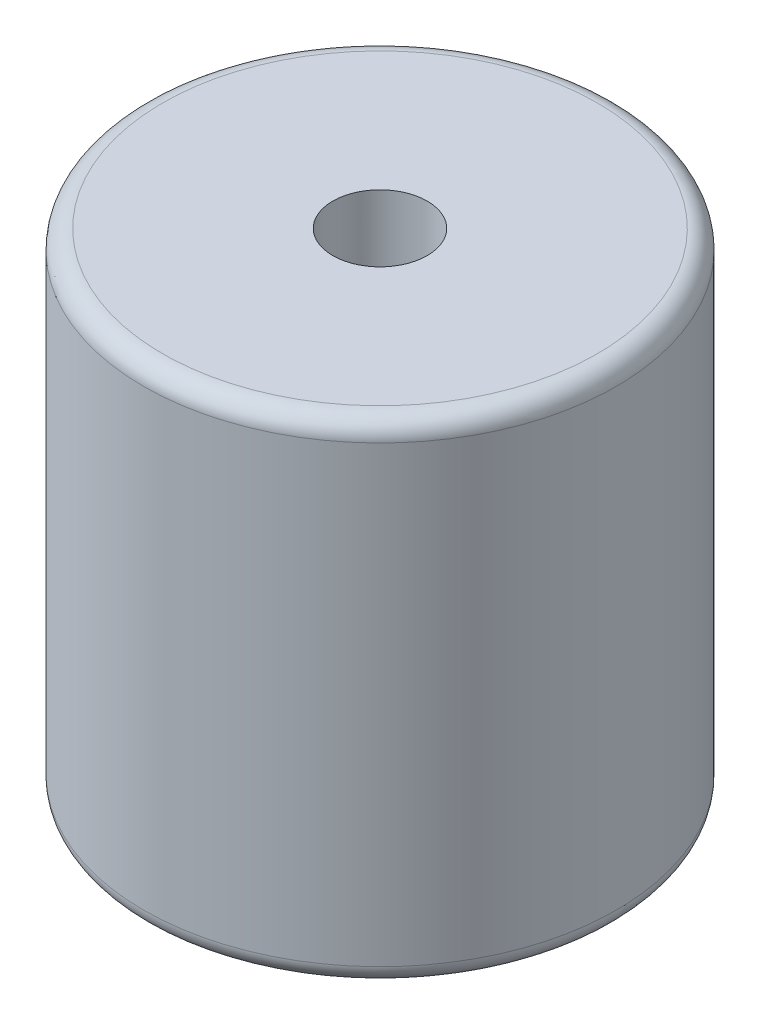
ISO-10303-21;
HEADER;
FILE_DESCRIPTION(('STEP AP214'),'2;1');
FILE_NAME('part.step','',(''),(''),'','','');
FILE_SCHEMA(('AUTOMOTIVE_DESIGN { 1 0 10303 214 1 1 1 1 }'));
ENDSEC;
DATA;
#1=APPLICATION_CONTEXT('core data for automotive mechanical design processes');
#2=APPLICATION_PROTOCOL_DEFINITION('international standard','automotive_design',2000,#1);
#3=PRODUCT_CONTEXT('',#1,'mechanical');
#4=PRODUCT('Part','Part','',(#3));
#5=PRODUCT_RELATED_PRODUCT_CATEGORY('part','',(#4));
#6=PRODUCT_DEFINITION_FORMATION('','',#4);
#7=PRODUCT_DEFINITION_CONTEXT('part definition',#1,'design');
#8=PRODUCT_DEFINITION('design','',#6,#7);
#9=PRODUCT_DEFINITION_SHAPE('','',#8);
#10=(LENGTH_UNIT() NAMED_UNIT(*) SI_UNIT(.MILLI.,.METRE.));
#11=(NAMED_UNIT(*) PLANE_ANGLE_UNIT() SI_UNIT($,.RADIAN.));
#12=(NAMED_UNIT(*) SI_UNIT($,.STERADIAN.) SOLID_ANGLE_UNIT());
#13=UNCERTAINTY_MEASURE_WITH_UNIT(LENGTH_MEASURE(1.E-05),#10,'distance_accuracy_value','');
#14=(GEOMETRIC_REPRESENTATION_CONTEXT(3) GLOBAL_UNCERTAINTY_ASSIGNED_CONTEXT((#13)) GLOBAL_UNIT_ASSIGNED_CONTEXT((#10,
#11,#12)) REPRESENTATION_CONTEXT('',''));
#15=CARTESIAN_POINT('',(0.,0.,0.));
#16=DIRECTION('',(0.,0.,1.));
#17=DIRECTION('',(1.,0.,0.));
#18=AXIS2_PLACEMENT_3D('',#15,#16,#17);
#19=CARTESIAN_POINT('',(0.,-8.,2.5));
#20=DIRECTION('',(0.,-1.,0.));
#21=DIRECTION('',(0.,0.,-1.));
#22=AXIS2_PLACEMENT_3D('',#19,#20,#21);
#23=PLANE('',#22);
#24=CARTESIAN_POINT('',(0.,-8.,0.));
#25=DIRECTION('',(0.,-1.,0.));
#26=DIRECTION('',(0.,0.,-1.));
#27=AXIS2_PLACEMENT_3D('',#24,#25,#26);
#28=CIRCLE('',#27,11.5);
#29=CARTESIAN_POINT('',(0.,-8.,-11.5));
#30=VERTEX_POINT('',#29);
#31=EDGE_CURVE('E21',#30,#30,#28,.F.);
#32=ORIENTED_EDGE('',*,*,#31,.T.);
#33=EDGE_LOOP('',(#32));
#34=FACE_BOUND('',#33,.T.);
#35=CARTESIAN_POINT('',(0.,-8.00000000000001,0.));
#36=DIRECTION('',(0.,-1.,0.));
#37=DIRECTION('',(0.,0.,-1.));
#38=AXIS2_PLACEMENT_3D('',#35,#36,#37);
#39=CIRCLE('',#38,2.5);
#40=CARTESIAN_POINT('',(0.,-8.00000000000001,-2.5));
#41=VERTEX_POINT('',#40);
#42=EDGE_CURVE('E32',#41,#41,#39,.F.);
#43=ORIENTED_EDGE('',*,*,#42,.F.);
#44=EDGE_LOOP('',(#43));
#45=FACE_BOUND('',#44,.T.);
#46=ADVANCED_FACE('F17',(#34,#45),#23,.F.);
#47=CARTESIAN_POINT('',(0.,4.4,0.));
#48=DIRECTION('',(0.,-1.,0.));
#49=DIRECTION('',(0.,0.,-1.));
#50=AXIS2_PLACEMENT_3D('',#47,#48,#49);
#51=CYLINDRICAL_SURFACE('',#50,12.5);
#52=CARTESIAN_POINT('',(0.,-33.,0.));
#53=DIRECTION('',(0.,1.,0.));
#54=DIRECTION('',(0.,0.,1.));
#55=AXIS2_PLACEMENT_3D('',#52,#53,#54);
#56=CIRCLE('',#55,12.5);
#57=CARTESIAN_POINT('',(0.,-33.,12.5));
#58=VERTEX_POINT('',#57);
#59=EDGE_CURVE('E11',#58,#58,#56,.T.);
#60=ORIENTED_EDGE('',*,*,#59,.T.);
#61=EDGE_LOOP('',(#60));
#62=FACE_BOUND('',#61,.T.);
#63=CARTESIAN_POINT('',(0.,-9.,0.));
#64=DIRECTION('',(0.,-1.,0.));
#65=DIRECTION('',(0.,0.,-1.));
#66=AXIS2_PLACEMENT_3D('',#63,#64,#65);
#67=CIRCLE('',#66,12.5);
#68=CARTESIAN_POINT('',(0.,-9.,-12.5));
#69=VERTEX_POINT('',#68);
#70=EDGE_CURVE('E34',#69,#69,#67,.T.);
#71=ORIENTED_EDGE('',*,*,#70,.T.);
#72=EDGE_LOOP('',(#71));
#73=FACE_BOUND('',#72,.T.);
#74=ADVANCED_FACE('F50',(#62,#73),#51,.T.);
#75=CARTESIAN_POINT('',(0.,-34.,14.));
#76=DIRECTION('',(0.,1.,0.));
#77=DIRECTION('',(0.,0.,1.));
#78=AXIS2_PLACEMENT_3D('',#75,#76,#77);
#79=PLANE('',#78);
#80=CARTESIAN_POINT('',(0.,-34.,0.));
#81=DIRECTION('',(0.,1.,0.));
#82=DIRECTION('',(0.,0.,1.));
#83=AXIS2_PLACEMENT_3D('',#80,#81,#82);
#84=CIRCLE('',#83,11.5);
#85=CARTESIAN_POINT('',(0.,-34.,11.5));
#86=VERTEX_POINT('',#85);
#87=EDGE_CURVE('E25',#86,#86,#84,.F.);
#88=ORIENTED_EDGE('',*,*,#87,.T.);
#89=EDGE_LOOP('',(#88));
#90=FACE_BOUND('',#89,.T.);
#91=CARTESIAN_POINT('',(0.,-34.,0.));
#92=DIRECTION('',(0.,1.,0.));
#93=DIRECTION('',(0.,0.,1.));
#94=AXIS2_PLACEMENT_3D('',#91,#92,#93);
#95=CIRCLE('',#94,2.5);
#96=CARTESIAN_POINT('',(0.,-34.,2.5));
#97=VERTEX_POINT('',#96);
#98=EDGE_CURVE('E40',#97,#97,#95,.F.);
#99=ORIENTED_EDGE('',*,*,#98,.F.);
#100=EDGE_LOOP('',(#99));
#101=FACE_BOUND('',#100,.T.);
#102=ADVANCED_FACE('F48',(#90,#101),#79,.F.);
#103=CARTESIAN_POINT('',(0.,-9.,0.));
#104=DIRECTION('',(0.,-1.,0.));
#105=DIRECTION('',(0.,0.,-1.));
#106=AXIS2_PLACEMENT_3D('',#103,#104,#105);
#107=TOROIDAL_SURFACE('',#106,11.5,1.);
#108=ORIENTED_EDGE('',*,*,#31,.F.);
#109=EDGE_LOOP('',(#108));
#110=FACE_BOUND('',#109,.T.);
#111=ORIENTED_EDGE('',*,*,#70,.F.);
#112=EDGE_LOOP('',(#111));
#113=FACE_BOUND('',#112,.T.);
#114=ADVANCED_FACE('F19',(#110,#113),#107,.T.);
#115=CARTESIAN_POINT('',(0.,-33.,0.));
#116=DIRECTION('',(0.,1.,0.));
#117=DIRECTION('',(0.,0.,1.));
#118=AXIS2_PLACEMENT_3D('',#115,#116,#117);
#119=TOROIDAL_SURFACE('',#118,11.5,1.);
#120=ORIENTED_EDGE('',*,*,#59,.F.);
#121=EDGE_LOOP('',(#120));
#122=FACE_BOUND('',#121,.T.);
#123=ORIENTED_EDGE('',*,*,#87,.F.);
#124=EDGE_LOOP('',(#123));
#125=FACE_BOUND('',#124,.T.);
#126=ADVANCED_FACE('F58',(#122,#125),#119,.T.);
#127=CARTESIAN_POINT('',(0.,-79.9282385393826,0.));
#128=DIRECTION('',(0.,1.,0.));
#129=DIRECTION('',(0.,0.,1.));
#130=AXIS2_PLACEMENT_3D('',#127,#128,#129);
#131=CYLINDRICAL_SURFACE('',#130,2.5);
#132=ORIENTED_EDGE('',*,*,#98,.T.);
#133=EDGE_LOOP('',(#132));
#134=FACE_BOUND('',#133,.T.);
#135=ORIENTED_EDGE('',*,*,#42,.T.);
#136=EDGE_LOOP('',(#135));
#137=FACE_BOUND('',#136,.T.);
#138=ADVANCED_FACE('F46',(#134,#137),#131,.F.);
#139=CLOSED_SHELL('',(#46,#74,#102,#114,#126,#138));
#140=MANIFOLD_SOLID_BREP('B1',#139);
#141=ADVANCED_BREP_SHAPE_REPRESENTATION('',(#18,#140),#14);
#142=SHAPE_DEFINITION_REPRESENTATION(#9,#141);
ENDSEC;
END-ISO-10303-21;
